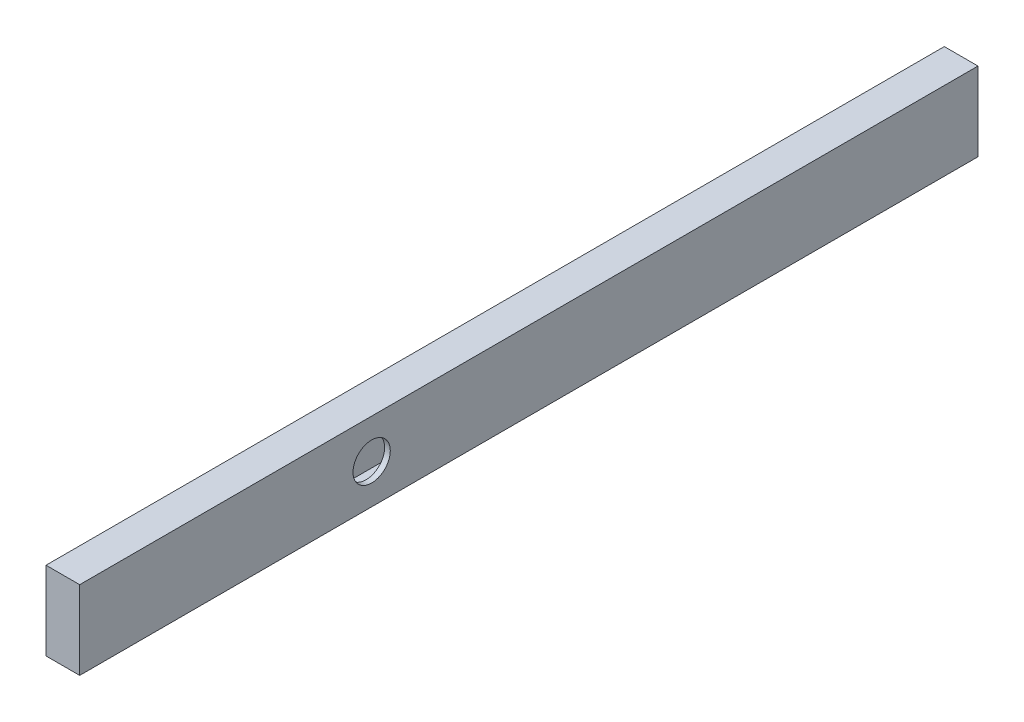
ISO-10303-21;
HEADER;
FILE_DESCRIPTION(('STEP AP214'),'2;1');
FILE_NAME('part.step','',(''),(''),'','','');
FILE_SCHEMA(('AUTOMOTIVE_DESIGN { 1 0 10303 214 1 1 1 1 }'));
ENDSEC;
DATA;
#1=APPLICATION_CONTEXT('core data for automotive mechanical design processes');
#2=APPLICATION_PROTOCOL_DEFINITION('international standard','automotive_design',2000,#1);
#3=PRODUCT_CONTEXT('',#1,'mechanical');
#4=PRODUCT('Part','Part','',(#3));
#5=PRODUCT_RELATED_PRODUCT_CATEGORY('part','',(#4));
#6=PRODUCT_DEFINITION_FORMATION('','',#4);
#7=PRODUCT_DEFINITION_CONTEXT('part definition',#1,'design');
#8=PRODUCT_DEFINITION('design','',#6,#7);
#9=PRODUCT_DEFINITION_SHAPE('','',#8);
#10=(LENGTH_UNIT() NAMED_UNIT(*) SI_UNIT(.MILLI.,.METRE.));
#11=(NAMED_UNIT(*) PLANE_ANGLE_UNIT() SI_UNIT($,.RADIAN.));
#12=(NAMED_UNIT(*) SI_UNIT($,.STERADIAN.) SOLID_ANGLE_UNIT());
#13=UNCERTAINTY_MEASURE_WITH_UNIT(LENGTH_MEASURE(1.E-05),#10,'distance_accuracy_value','');
#14=(GEOMETRIC_REPRESENTATION_CONTEXT(3) GLOBAL_UNCERTAINTY_ASSIGNED_CONTEXT((#13)) GLOBAL_UNIT_ASSIGNED_CONTEXT((#10,
#11,#12)) REPRESENTATION_CONTEXT('',''));
#15=CARTESIAN_POINT('',(0.,0.,0.));
#16=DIRECTION('',(0.,0.,1.));
#17=DIRECTION('',(1.,0.,0.));
#18=AXIS2_PLACEMENT_3D('',#15,#16,#17);
#19=CARTESIAN_POINT('',(0.,0.,0.));
#20=DIRECTION('',(0.,0.,-1.));
#21=DIRECTION('',(-1.,0.,0.));
#22=AXIS2_PLACEMENT_3D('',#19,#20,#21);
#23=PLANE('',#22);
#24=DIRECTION('',(-1.,0.,0.));
#25=VECTOR('',#24,1.);
#26=CARTESIAN_POINT('',(19.05,44.45,0.));
#27=LINE('',#26,#25);
#28=CARTESIAN_POINT('',(19.05,44.45,0.));
#29=VERTEX_POINT('',#28);
#30=CARTESIAN_POINT('',(-19.05,44.45,0.));
#31=VERTEX_POINT('',#30);
#32=EDGE_CURVE('E147',#29,#31,#27,.T.);
#33=ORIENTED_EDGE('',*,*,#32,.F.);
#34=DIRECTION('',(0.,1.,0.));
#35=VECTOR('',#34,1.);
#36=CARTESIAN_POINT('',(19.05,-44.45,0.));
#37=LINE('',#36,#35);
#38=CARTESIAN_POINT('',(19.05,-44.45,0.));
#39=VERTEX_POINT('',#38);
#40=EDGE_CURVE('E92',#39,#29,#37,.T.);
#41=ORIENTED_EDGE('',*,*,#40,.F.);
#42=DIRECTION('',(1.,0.,0.));
#43=VECTOR('',#42,1.);
#44=CARTESIAN_POINT('',(19.05,-44.45,0.));
#45=LINE('',#44,#43);
#46=CARTESIAN_POINT('',(-19.05,-44.45,0.));
#47=VERTEX_POINT('',#46);
#48=EDGE_CURVE('E193',#47,#39,#45,.T.);
#49=ORIENTED_EDGE('',*,*,#48,.F.);
#50=DIRECTION('',(0.,-1.,0.));
#51=VECTOR('',#50,1.);
#52=CARTESIAN_POINT('',(-19.05,-44.45,0.));
#53=LINE('',#52,#51);
#54=EDGE_CURVE('E153',#31,#47,#53,.T.);
#55=ORIENTED_EDGE('',*,*,#54,.F.);
#56=EDGE_LOOP('',(#33,#41,#49,#55));
#57=FACE_BOUND('',#56,.T.);
#58=DIRECTION('',(0.,1.,0.));
#59=VECTOR('',#58,1.);
#60=CARTESIAN_POINT('',(12.7,0.,0.));
#61=LINE('',#60,#59);
#62=CARTESIAN_POINT('',(12.7,-38.1,0.));
#63=VERTEX_POINT('',#62);
#64=CARTESIAN_POINT('',(12.7,38.1,0.));
#65=VERTEX_POINT('',#64);
#66=EDGE_CURVE('E141',#63,#65,#61,.T.);
#67=ORIENTED_EDGE('',*,*,#66,.T.);
#68=DIRECTION('',(-1.,0.,0.));
#69=VECTOR('',#68,1.);
#70=CARTESIAN_POINT('',(0.,38.1,0.));
#71=LINE('',#70,#69);
#72=CARTESIAN_POINT('',(-12.7,38.1,0.));
#73=VERTEX_POINT('',#72);
#74=EDGE_CURVE('E170',#65,#73,#71,.T.);
#75=ORIENTED_EDGE('',*,*,#74,.T.);
#76=DIRECTION('',(0.,-1.,0.));
#77=VECTOR('',#76,1.);
#78=CARTESIAN_POINT('',(-12.7,0.,0.));
#79=LINE('',#78,#77);
#80=CARTESIAN_POINT('',(-12.7,-38.1,0.));
#81=VERTEX_POINT('',#80);
#82=EDGE_CURVE('E145',#73,#81,#79,.T.);
#83=ORIENTED_EDGE('',*,*,#82,.T.);
#84=DIRECTION('',(1.,0.,0.));
#85=VECTOR('',#84,1.);
#86=CARTESIAN_POINT('',(0.,-38.1,0.));
#87=LINE('',#86,#85);
#88=EDGE_CURVE('E62',#81,#63,#87,.T.);
#89=ORIENTED_EDGE('',*,*,#88,.T.);
#90=EDGE_LOOP('',(#67,#75,#83,#89));
#91=FACE_BOUND('',#90,.T.);
#92=ADVANCED_FACE('F45',(#57,#91),#23,.T.);
#93=CARTESIAN_POINT('',(19.05,44.45,1016.));
#94=DIRECTION('',(0.,-1.,0.));
#95=DIRECTION('',(0.,0.,-1.));
#96=AXIS2_PLACEMENT_3D('',#93,#94,#95);
#97=PLANE('',#96);
#98=ORIENTED_EDGE('',*,*,#32,.T.);
#99=DIRECTION('',(0.,0.,-1.));
#100=VECTOR('',#99,1.);
#101=CARTESIAN_POINT('',(-19.05,44.45,1016.));
#102=LINE('',#101,#100);
#103=CARTESIAN_POINT('',(-19.05,44.45,1016.));
#104=VERTEX_POINT('',#103);
#105=EDGE_CURVE('E11',#104,#31,#102,.T.);
#106=ORIENTED_EDGE('',*,*,#105,.F.);
#107=DIRECTION('',(-1.,0.,0.));
#108=VECTOR('',#107,1.);
#109=CARTESIAN_POINT('',(19.05,44.45,1016.));
#110=LINE('',#109,#108);
#111=CARTESIAN_POINT('',(19.05,44.45,1016.));
#112=VERTEX_POINT('',#111);
#113=EDGE_CURVE('E180',#112,#104,#110,.T.);
#114=ORIENTED_EDGE('',*,*,#113,.F.);
#115=DIRECTION('',(0.,0.,-1.));
#116=VECTOR('',#115,1.);
#117=CARTESIAN_POINT('',(19.05,44.45,1016.));
#118=LINE('',#117,#116);
#119=EDGE_CURVE('E189',#112,#29,#118,.T.);
#120=ORIENTED_EDGE('',*,*,#119,.T.);
#121=EDGE_LOOP('',(#98,#106,#114,#120));
#122=FACE_BOUND('',#121,.T.);
#123=ADVANCED_FACE('F47',(#122),#97,.F.);
#124=CARTESIAN_POINT('',(-19.05,-44.45,1016.));
#125=DIRECTION('',(1.,0.,0.));
#126=DIRECTION('',(0.,0.,-1.));
#127=AXIS2_PLACEMENT_3D('',#124,#125,#126);
#128=PLANE('',#127);
#129=CARTESIAN_POINT('',(-19.05,0.,685.8));
#130=DIRECTION('',(1.,0.,0.));
#131=DIRECTION('',(0.,0.,-1.));
#132=AXIS2_PLACEMENT_3D('',#129,#130,#131);
#133=CIRCLE('',#132,21.082);
#134=CARTESIAN_POINT('',(-19.05,0.,664.718));
#135=VERTEX_POINT('',#134);
#136=EDGE_CURVE('E264',#135,#135,#133,.T.);
#137=ORIENTED_EDGE('',*,*,#136,.T.);
#138=EDGE_LOOP('',(#137));
#139=FACE_BOUND('',#138,.T.);
#140=ORIENTED_EDGE('',*,*,#54,.T.);
#141=DIRECTION('',(0.,0.,-1.));
#142=VECTOR('',#141,1.);
#143=CARTESIAN_POINT('',(-19.05,-44.45,1016.));
#144=LINE('',#143,#142);
#145=CARTESIAN_POINT('',(-19.05,-44.45,1016.));
#146=VERTEX_POINT('',#145);
#147=EDGE_CURVE('E55',#146,#47,#144,.T.);
#148=ORIENTED_EDGE('',*,*,#147,.F.);
#149=DIRECTION('',(0.,-1.,0.));
#150=VECTOR('',#149,1.);
#151=CARTESIAN_POINT('',(-19.05,-44.45,1016.));
#152=LINE('',#151,#150);
#153=EDGE_CURVE('E99',#104,#146,#152,.T.);
#154=ORIENTED_EDGE('',*,*,#153,.F.);
#155=ORIENTED_EDGE('',*,*,#105,.T.);
#156=EDGE_LOOP('',(#140,#148,#154,#155));
#157=FACE_BOUND('',#156,.T.);
#158=ADVANCED_FACE('F228',(#139,#157),#128,.F.);
#159=CARTESIAN_POINT('',(19.05,-44.45,1016.));
#160=DIRECTION('',(0.,1.,0.));
#161=DIRECTION('',(0.,0.,1.));
#162=AXIS2_PLACEMENT_3D('',#159,#160,#161);
#163=PLANE('',#162);
#164=ORIENTED_EDGE('',*,*,#48,.T.);
#165=DIRECTION('',(0.,0.,-1.));
#166=VECTOR('',#165,1.);
#167=CARTESIAN_POINT('',(19.05,-44.45,1016.));
#168=LINE('',#167,#166);
#169=CARTESIAN_POINT('',(19.05,-44.45,1016.));
#170=VERTEX_POINT('',#169);
#171=EDGE_CURVE('E200',#170,#39,#168,.T.);
#172=ORIENTED_EDGE('',*,*,#171,.F.);
#173=DIRECTION('',(1.,0.,0.));
#174=VECTOR('',#173,1.);
#175=CARTESIAN_POINT('',(19.05,-44.45,1016.));
#176=LINE('',#175,#174);
#177=EDGE_CURVE('E185',#146,#170,#176,.T.);
#178=ORIENTED_EDGE('',*,*,#177,.F.);
#179=ORIENTED_EDGE('',*,*,#147,.T.);
#180=EDGE_LOOP('',(#164,#172,#178,#179));
#181=FACE_BOUND('',#180,.T.);
#182=ADVANCED_FACE('F208',(#181),#163,.F.);
#183=CARTESIAN_POINT('',(19.05,-44.45,1016.));
#184=DIRECTION('',(-1.,0.,0.));
#185=DIRECTION('',(0.,0.,1.));
#186=AXIS2_PLACEMENT_3D('',#183,#184,#185);
#187=PLANE('',#186);
#188=CARTESIAN_POINT('',(19.05,0.,685.8));
#189=DIRECTION('',(1.,0.,0.));
#190=DIRECTION('',(0.,0.,-1.));
#191=AXIS2_PLACEMENT_3D('',#188,#189,#190);
#192=CIRCLE('',#191,21.082);
#193=CARTESIAN_POINT('',(19.05,0.,664.718));
#194=VERTEX_POINT('',#193);
#195=EDGE_CURVE('E262',#194,#194,#192,.T.);
#196=ORIENTED_EDGE('',*,*,#195,.F.);
#197=EDGE_LOOP('',(#196));
#198=FACE_BOUND('',#197,.T.);
#199=ORIENTED_EDGE('',*,*,#40,.T.);
#200=ORIENTED_EDGE('',*,*,#119,.F.);
#201=DIRECTION('',(0.,1.,0.));
#202=VECTOR('',#201,1.);
#203=CARTESIAN_POINT('',(19.05,-44.45,1016.));
#204=LINE('',#203,#202);
#205=EDGE_CURVE('E71',#170,#112,#204,.T.);
#206=ORIENTED_EDGE('',*,*,#205,.F.);
#207=ORIENTED_EDGE('',*,*,#171,.T.);
#208=EDGE_LOOP('',(#199,#200,#206,#207));
#209=FACE_BOUND('',#208,.T.);
#210=ADVANCED_FACE('F216',(#198,#209),#187,.F.);
#211=CARTESIAN_POINT('',(0.,0.,1016.));
#212=DIRECTION('',(0.,0.,-1.));
#213=DIRECTION('',(-1.,0.,0.));
#214=AXIS2_PLACEMENT_3D('',#211,#212,#213);
#215=PLANE('',#214);
#216=ORIENTED_EDGE('',*,*,#113,.T.);
#217=ORIENTED_EDGE('',*,*,#153,.T.);
#218=ORIENTED_EDGE('',*,*,#177,.T.);
#219=ORIENTED_EDGE('',*,*,#205,.T.);
#220=EDGE_LOOP('',(#216,#217,#218,#219));
#221=FACE_BOUND('',#220,.T.);
#222=ADVANCED_FACE('F218',(#221),#215,.F.);
#223=CARTESIAN_POINT('',(19.05,38.1,1016.));
#224=DIRECTION('',(0.,-1.,0.));
#225=DIRECTION('',(0.,0.,-1.));
#226=AXIS2_PLACEMENT_3D('',#223,#224,#225);
#227=PLANE('',#226);
#228=ORIENTED_EDGE('',*,*,#74,.F.);
#229=DIRECTION('',(0.,0.,-1.));
#230=VECTOR('',#229,1.);
#231=CARTESIAN_POINT('',(12.7,38.1,1016.));
#232=LINE('',#231,#230);
#233=CARTESIAN_POINT('',(12.7,38.1,1009.65));
#234=VERTEX_POINT('',#233);
#235=EDGE_CURVE('E139',#234,#65,#232,.T.);
#236=ORIENTED_EDGE('',*,*,#235,.F.);
#237=DIRECTION('',(-1.,0.,0.));
#238=VECTOR('',#237,1.);
#239=CARTESIAN_POINT('',(0.,38.1,1009.65));
#240=LINE('',#239,#238);
#241=CARTESIAN_POINT('',(-12.7,38.1,1009.65));
#242=VERTEX_POINT('',#241);
#243=EDGE_CURVE('E126',#234,#242,#240,.T.);
#244=ORIENTED_EDGE('',*,*,#243,.T.);
#245=DIRECTION('',(0.,0.,-1.));
#246=VECTOR('',#245,1.);
#247=CARTESIAN_POINT('',(-12.7,38.1,1016.));
#248=LINE('',#247,#246);
#249=EDGE_CURVE('E137',#242,#73,#248,.T.);
#250=ORIENTED_EDGE('',*,*,#249,.T.);
#251=EDGE_LOOP('',(#228,#236,#244,#250));
#252=FACE_BOUND('',#251,.T.);
#253=ADVANCED_FACE('F136',(#252),#227,.T.);
#254=CARTESIAN_POINT('',(-12.7,-44.45,1016.));
#255=DIRECTION('',(1.,0.,0.));
#256=DIRECTION('',(0.,0.,-1.));
#257=AXIS2_PLACEMENT_3D('',#254,#255,#256);
#258=PLANE('',#257);
#259=CARTESIAN_POINT('',(-12.7,0.,685.8));
#260=DIRECTION('',(1.,0.,0.));
#261=DIRECTION('',(0.,0.,-1.));
#262=AXIS2_PLACEMENT_3D('',#259,#260,#261);
#263=CIRCLE('',#262,21.082);
#264=CARTESIAN_POINT('',(-12.7,0.,664.718));
#265=VERTEX_POINT('',#264);
#266=EDGE_CURVE('E158',#265,#265,#263,.T.);
#267=ORIENTED_EDGE('',*,*,#266,.F.);
#268=EDGE_LOOP('',(#267));
#269=FACE_BOUND('',#268,.T.);
#270=ORIENTED_EDGE('',*,*,#82,.F.);
#271=ORIENTED_EDGE('',*,*,#249,.F.);
#272=DIRECTION('',(0.,-1.,0.));
#273=VECTOR('',#272,1.);
#274=CARTESIAN_POINT('',(-12.7,0.,1009.65));
#275=LINE('',#274,#273);
#276=CARTESIAN_POINT('',(-12.7,-38.1,1009.65));
#277=VERTEX_POINT('',#276);
#278=EDGE_CURVE('E122',#242,#277,#275,.T.);
#279=ORIENTED_EDGE('',*,*,#278,.T.);
#280=DIRECTION('',(0.,0.,-1.));
#281=VECTOR('',#280,1.);
#282=CARTESIAN_POINT('',(-12.7,-38.1,1016.));
#283=LINE('',#282,#281);
#284=EDGE_CURVE('E148',#277,#81,#283,.T.);
#285=ORIENTED_EDGE('',*,*,#284,.T.);
#286=EDGE_LOOP('',(#270,#271,#279,#285));
#287=FACE_BOUND('',#286,.T.);
#288=ADVANCED_FACE('F143',(#269,#287),#258,.T.);
#289=CARTESIAN_POINT('',(19.05,-38.1,1016.));
#290=DIRECTION('',(0.,1.,0.));
#291=DIRECTION('',(0.,0.,1.));
#292=AXIS2_PLACEMENT_3D('',#289,#290,#291);
#293=PLANE('',#292);
#294=ORIENTED_EDGE('',*,*,#88,.F.);
#295=ORIENTED_EDGE('',*,*,#284,.F.);
#296=DIRECTION('',(1.,0.,0.));
#297=VECTOR('',#296,1.);
#298=CARTESIAN_POINT('',(0.,-38.1,1009.65));
#299=LINE('',#298,#297);
#300=CARTESIAN_POINT('',(12.7,-38.1,1009.65));
#301=VERTEX_POINT('',#300);
#302=EDGE_CURVE('E127',#277,#301,#299,.T.);
#303=ORIENTED_EDGE('',*,*,#302,.T.);
#304=DIRECTION('',(0.,0.,-1.));
#305=VECTOR('',#304,1.);
#306=CARTESIAN_POINT('',(12.7,-38.1,1016.));
#307=LINE('',#306,#305);
#308=EDGE_CURVE('E155',#301,#63,#307,.T.);
#309=ORIENTED_EDGE('',*,*,#308,.T.);
#310=EDGE_LOOP('',(#294,#295,#303,#309));
#311=FACE_BOUND('',#310,.T.);
#312=ADVANCED_FACE('F244',(#311),#293,.T.);
#313=CARTESIAN_POINT('',(12.7,-44.45,1016.));
#314=DIRECTION('',(-1.,0.,0.));
#315=DIRECTION('',(0.,0.,1.));
#316=AXIS2_PLACEMENT_3D('',#313,#314,#315);
#317=PLANE('',#316);
#318=CARTESIAN_POINT('',(12.7,0.,685.8));
#319=DIRECTION('',(-1.,0.,0.));
#320=DIRECTION('',(0.,0.,1.));
#321=AXIS2_PLACEMENT_3D('',#318,#319,#320);
#322=CIRCLE('',#321,21.082);
#323=CARTESIAN_POINT('',(12.7,0.,706.882));
#324=VERTEX_POINT('',#323);
#325=EDGE_CURVE('E49',#324,#324,#322,.T.);
#326=ORIENTED_EDGE('',*,*,#325,.F.);
#327=EDGE_LOOP('',(#326));
#328=FACE_BOUND('',#327,.T.);
#329=ORIENTED_EDGE('',*,*,#66,.F.);
#330=ORIENTED_EDGE('',*,*,#308,.F.);
#331=DIRECTION('',(0.,1.,0.));
#332=VECTOR('',#331,1.);
#333=CARTESIAN_POINT('',(12.7,0.,1009.65));
#334=LINE('',#333,#332);
#335=EDGE_CURVE('E162',#301,#234,#334,.T.);
#336=ORIENTED_EDGE('',*,*,#335,.T.);
#337=ORIENTED_EDGE('',*,*,#235,.T.);
#338=EDGE_LOOP('',(#329,#330,#336,#337));
#339=FACE_BOUND('',#338,.T.);
#340=ADVANCED_FACE('F241',(#328,#339),#317,.T.);
#341=CARTESIAN_POINT('',(0.,0.,1009.65));
#342=DIRECTION('',(0.,0.,-1.));
#343=DIRECTION('',(-1.,0.,0.));
#344=AXIS2_PLACEMENT_3D('',#341,#342,#343);
#345=PLANE('',#344);
#346=ORIENTED_EDGE('',*,*,#243,.F.);
#347=ORIENTED_EDGE('',*,*,#335,.F.);
#348=ORIENTED_EDGE('',*,*,#302,.F.);
#349=ORIENTED_EDGE('',*,*,#278,.F.);
#350=EDGE_LOOP('',(#346,#347,#348,#349));
#351=FACE_BOUND('',#350,.T.);
#352=ADVANCED_FACE('F124',(#351),#345,.T.);
#353=CARTESIAN_POINT('',(19.05,0.,685.8));
#354=DIRECTION('',(1.,0.,0.));
#355=DIRECTION('',(0.,0.,-1.));
#356=AXIS2_PLACEMENT_3D('',#353,#354,#355);
#357=CYLINDRICAL_SURFACE('',#356,21.082);
#358=ORIENTED_EDGE('',*,*,#325,.T.);
#359=EDGE_LOOP('',(#358));
#360=FACE_BOUND('',#359,.T.);
#361=ORIENTED_EDGE('',*,*,#195,.T.);
#362=EDGE_LOOP('',(#361));
#363=FACE_BOUND('',#362,.T.);
#364=ADVANCED_FACE('F240',(#360,#363),#357,.F.);
#365=ORIENTED_EDGE('',*,*,#266,.T.);
#366=EDGE_LOOP('',(#365));
#367=FACE_BOUND('',#366,.T.);
#368=ORIENTED_EDGE('',*,*,#136,.F.);
#369=EDGE_LOOP('',(#368));
#370=FACE_BOUND('',#369,.T.);
#371=ADVANCED_FACE('F252',(#367,#370),#357,.F.);
#372=CLOSED_SHELL('',(#92,#123,#158,#182,#210,#222,#253,#288,#312,#340,#352,#364,#371));
#373=MANIFOLD_SOLID_BREP('B2',#372);
#374=ADVANCED_BREP_SHAPE_REPRESENTATION('',(#18,#373),#14);
#375=SHAPE_DEFINITION_REPRESENTATION(#9,#374);
ENDSEC;
END-ISO-10303-21;
